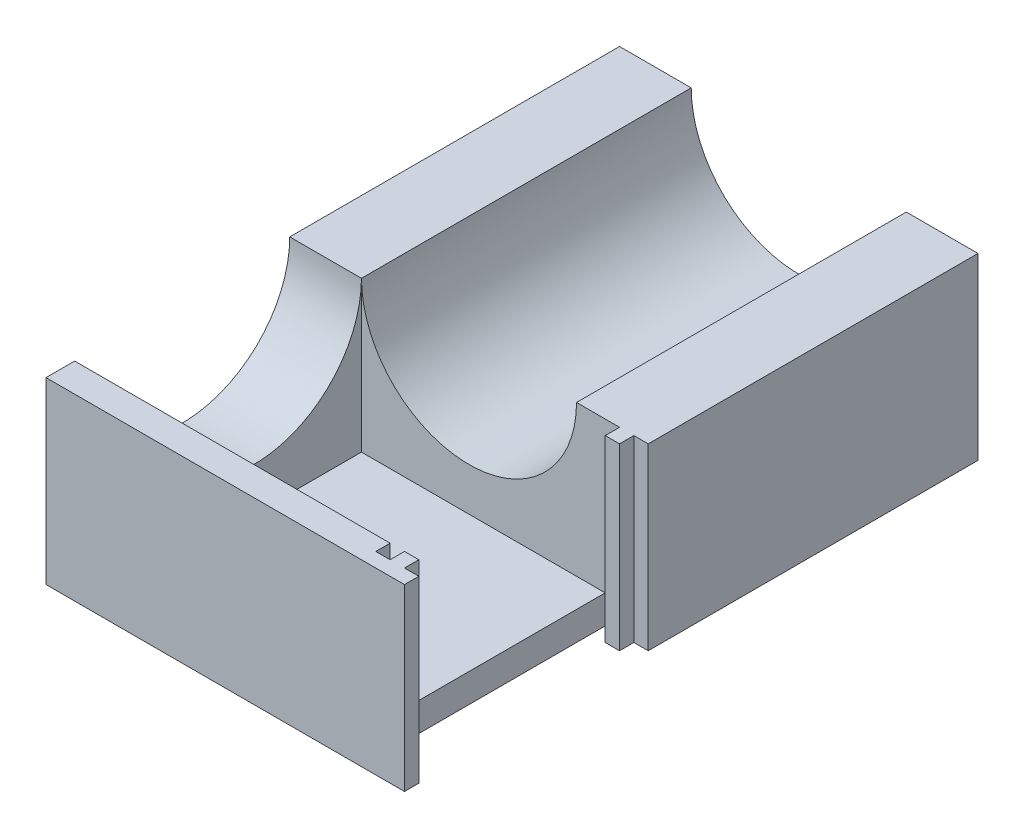
ISO-10303-21;
HEADER;
FILE_DESCRIPTION(('STEP AP214'),'2;1');
FILE_NAME('part.step','',(''),(''),'','','');
FILE_SCHEMA(('AUTOMOTIVE_DESIGN { 1 0 10303 214 1 1 1 1 }'));
ENDSEC;
DATA;
#1=APPLICATION_CONTEXT('core data for automotive mechanical design processes');
#2=APPLICATION_PROTOCOL_DEFINITION('international standard','automotive_design',2000,#1);
#3=PRODUCT_CONTEXT('',#1,'mechanical');
#4=PRODUCT('Part','Part','',(#3));
#5=PRODUCT_RELATED_PRODUCT_CATEGORY('part','',(#4));
#6=PRODUCT_DEFINITION_FORMATION('','',#4);
#7=PRODUCT_DEFINITION_CONTEXT('part definition',#1,'design');
#8=PRODUCT_DEFINITION('design','',#6,#7);
#9=PRODUCT_DEFINITION_SHAPE('','',#8);
#10=(LENGTH_UNIT() NAMED_UNIT(*) SI_UNIT(.MILLI.,.METRE.));
#11=(NAMED_UNIT(*) PLANE_ANGLE_UNIT() SI_UNIT($,.RADIAN.));
#12=(NAMED_UNIT(*) SI_UNIT($,.STERADIAN.) SOLID_ANGLE_UNIT());
#13=UNCERTAINTY_MEASURE_WITH_UNIT(LENGTH_MEASURE(1.E-05),#10,'distance_accuracy_value','');
#14=(GEOMETRIC_REPRESENTATION_CONTEXT(3) GLOBAL_UNCERTAINTY_ASSIGNED_CONTEXT((#13)) GLOBAL_UNIT_ASSIGNED_CONTEXT((#10,
#11,#12)) REPRESENTATION_CONTEXT('',''));
#15=CARTESIAN_POINT('',(0.,0.,0.));
#16=DIRECTION('',(0.,0.,1.));
#17=DIRECTION('',(1.,0.,0.));
#18=AXIS2_PLACEMENT_3D('',#15,#16,#17);
#19=CARTESIAN_POINT('',(0.,0.,0.));
#20=DIRECTION('',(0.,1.,0.));
#21=DIRECTION('',(0.,0.,1.));
#22=AXIS2_PLACEMENT_3D('',#19,#20,#21);
#23=PLANE('',#22);
#24=DIRECTION('',(-1.,0.,0.));
#25=VECTOR('',#24,1.);
#26=CARTESIAN_POINT('',(0.,0.,0.));
#27=LINE('',#26,#25);
#28=CARTESIAN_POINT('',(12.5,0.,0.));
#29=VERTEX_POINT('',#28);
#30=CARTESIAN_POINT('',(7.5,0.,0.));
#31=VERTEX_POINT('',#30);
#32=EDGE_CURVE('E328',#29,#31,#27,.T.);
#33=ORIENTED_EDGE('',*,*,#32,.T.);
#34=DIRECTION('',(0.,0.,-1.));
#35=VECTOR('',#34,1.);
#36=CARTESIAN_POINT('',(7.5,0.,59.2132034355964));
#37=LINE('',#36,#35);
#38=CARTESIAN_POINT('',(7.5,0.,23.));
#39=VERTEX_POINT('',#38);
#40=EDGE_CURVE('E219',#31,#39,#37,.F.);
#41=ORIENTED_EDGE('',*,*,#40,.T.);
#42=DIRECTION('',(1.,0.,0.));
#43=VECTOR('',#42,1.);
#44=CARTESIAN_POINT('',(0.,0.,23.));
#45=LINE('',#44,#43);
#46=CARTESIAN_POINT('',(10.5,0.,23.));
#47=VERTEX_POINT('',#46);
#48=EDGE_CURVE('E206',#39,#47,#45,.T.);
#49=ORIENTED_EDGE('',*,*,#48,.T.);
#50=DIRECTION('',(0.,0.,1.));
#51=VECTOR('',#50,1.);
#52=CARTESIAN_POINT('',(10.5,0.,24.));
#53=LINE('',#52,#51);
#54=CARTESIAN_POINT('',(10.5,0.,24.));
#55=VERTEX_POINT('',#54);
#56=EDGE_CURVE('E349',#47,#55,#53,.T.);
#57=ORIENTED_EDGE('',*,*,#56,.T.);
#58=DIRECTION('',(1.,0.,0.));
#59=VECTOR('',#58,1.);
#60=CARTESIAN_POINT('',(11.5,0.,24.));
#61=LINE('',#60,#59);
#62=CARTESIAN_POINT('',(11.5,0.,24.));
#63=VERTEX_POINT('',#62);
#64=EDGE_CURVE('E352',#55,#63,#61,.T.);
#65=ORIENTED_EDGE('',*,*,#64,.T.);
#66=DIRECTION('',(0.,0.,-1.));
#67=VECTOR('',#66,1.);
#68=CARTESIAN_POINT('',(11.5,0.,23.));
#69=LINE('',#68,#67);
#70=CARTESIAN_POINT('',(11.5,0.,23.));
#71=VERTEX_POINT('',#70);
#72=EDGE_CURVE('E229',#63,#71,#69,.T.);
#73=ORIENTED_EDGE('',*,*,#72,.T.);
#74=DIRECTION('',(1.,0.,0.));
#75=VECTOR('',#74,1.);
#76=CARTESIAN_POINT('',(12.5,0.,23.));
#77=LINE('',#76,#75);
#78=CARTESIAN_POINT('',(12.5,0.,23.));
#79=VERTEX_POINT('',#78);
#80=EDGE_CURVE('E226',#71,#79,#77,.T.);
#81=ORIENTED_EDGE('',*,*,#80,.T.);
#82=DIRECTION('',(0.,0.,-1.));
#83=VECTOR('',#82,1.);
#84=CARTESIAN_POINT('',(12.5,0.,40.));
#85=LINE('',#84,#83);
#86=EDGE_CURVE('E220',#79,#29,#85,.T.);
#87=ORIENTED_EDGE('',*,*,#86,.T.);
#88=EDGE_LOOP('',(#33,#41,#49,#57,#65,#73,#81,#87));
#89=FACE_BOUND('',#88,.T.);
#90=ADVANCED_FACE('F34',(#89),#23,.T.);
#91=DIRECTION('',(0.,0.,-1.));
#92=VECTOR('',#91,1.);
#93=CARTESIAN_POINT('',(-7.5,0.,59.2132034355964));
#94=LINE('',#93,#92);
#95=CARTESIAN_POINT('',(-7.5,0.,23.));
#96=VERTEX_POINT('',#95);
#97=CARTESIAN_POINT('',(-7.5,0.,0.));
#98=VERTEX_POINT('',#97);
#99=EDGE_CURVE('E214',#96,#98,#94,.T.);
#100=ORIENTED_EDGE('',*,*,#99,.T.);
#101=CARTESIAN_POINT('',(-12.5,0.,0.));
#102=VERTEX_POINT('',#101);
#103=EDGE_CURVE('E329',#98,#102,#27,.T.);
#104=ORIENTED_EDGE('',*,*,#103,.T.);
#105=DIRECTION('',(0.,0.,1.));
#106=VECTOR('',#105,1.);
#107=CARTESIAN_POINT('',(-12.5,0.,40.));
#108=LINE('',#107,#106);
#109=CARTESIAN_POINT('',(-12.5,0.,23.));
#110=VERTEX_POINT('',#109);
#111=EDGE_CURVE('E225',#102,#110,#108,.T.);
#112=ORIENTED_EDGE('',*,*,#111,.T.);
#113=DIRECTION('',(-1.,0.,0.));
#114=VECTOR('',#113,1.);
#115=CARTESIAN_POINT('',(12.501,0.,23.));
#116=LINE('',#115,#114);
#117=EDGE_CURVE('E198',#110,#96,#116,.F.);
#118=ORIENTED_EDGE('',*,*,#117,.T.);
#119=EDGE_LOOP('',(#100,#104,#112,#118));
#120=FACE_BOUND('',#119,.T.);
#121=ADVANCED_FACE('F223',(#120),#23,.T.);
#122=DIRECTION('',(0.,0.,-1.));
#123=VECTOR('',#122,1.);
#124=CARTESIAN_POINT('',(12.5,0.,40.));
#125=LINE('',#124,#123);
#126=CARTESIAN_POINT('',(12.5,0.,40.));
#127=VERTEX_POINT('',#126);
#128=CARTESIAN_POINT('',(12.5,0.,39.));
#129=VERTEX_POINT('',#128);
#130=EDGE_CURVE('E318',#127,#129,#125,.T.);
#131=ORIENTED_EDGE('',*,*,#130,.T.);
#132=DIRECTION('',(-1.,0.,0.));
#133=VECTOR('',#132,1.);
#134=CARTESIAN_POINT('',(12.5,0.,39.));
#135=LINE('',#134,#133);
#136=CARTESIAN_POINT('',(11.5,0.,39.));
#137=VERTEX_POINT('',#136);
#138=EDGE_CURVE('E334',#129,#137,#135,.T.);
#139=ORIENTED_EDGE('',*,*,#138,.T.);
#140=DIRECTION('',(0.,0.,-1.));
#141=VECTOR('',#140,1.);
#142=CARTESIAN_POINT('',(11.5,0.,39.));
#143=LINE('',#142,#141);
#144=CARTESIAN_POINT('',(11.5,0.,38.));
#145=VERTEX_POINT('',#144);
#146=EDGE_CURVE('E337',#137,#145,#143,.T.);
#147=ORIENTED_EDGE('',*,*,#146,.T.);
#148=DIRECTION('',(-1.,0.,0.));
#149=VECTOR('',#148,1.);
#150=CARTESIAN_POINT('',(11.5,0.,38.));
#151=LINE('',#150,#149);
#152=CARTESIAN_POINT('',(10.5,0.,38.));
#153=VERTEX_POINT('',#152);
#154=EDGE_CURVE('E340',#145,#153,#151,.T.);
#155=ORIENTED_EDGE('',*,*,#154,.T.);
#156=DIRECTION('',(0.,0.,1.));
#157=VECTOR('',#156,1.);
#158=CARTESIAN_POINT('',(10.5,0.,38.));
#159=LINE('',#158,#157);
#160=CARTESIAN_POINT('',(10.5,0.,39.));
#161=VERTEX_POINT('',#160);
#162=EDGE_CURVE('E343',#153,#161,#159,.T.);
#163=ORIENTED_EDGE('',*,*,#162,.T.);
#164=DIRECTION('',(-1.,0.,0.));
#165=VECTOR('',#164,1.);
#166=CARTESIAN_POINT('',(10.5,0.,39.));
#167=LINE('',#166,#165);
#168=CARTESIAN_POINT('',(9.50000000000001,0.,39.));
#169=VERTEX_POINT('',#168);
#170=EDGE_CURVE('E346',#161,#169,#167,.T.);
#171=ORIENTED_EDGE('',*,*,#170,.T.);
#172=DIRECTION('',(0.,0.,-1.));
#173=VECTOR('',#172,1.);
#174=CARTESIAN_POINT('',(9.5,0.,23.));
#175=LINE('',#174,#173);
#176=CARTESIAN_POINT('',(9.5,0.,38.));
#177=VERTEX_POINT('',#176);
#178=EDGE_CURVE('E331',#169,#177,#175,.T.);
#179=ORIENTED_EDGE('',*,*,#178,.T.);
#180=DIRECTION('',(1.,0.,0.));
#181=VECTOR('',#180,1.);
#182=CARTESIAN_POINT('',(0.,0.,38.));
#183=LINE('',#182,#181);
#184=CARTESIAN_POINT('',(-7.5,0.,38.));
#185=VERTEX_POINT('',#184);
#186=EDGE_CURVE('E315',#185,#177,#183,.T.);
#187=ORIENTED_EDGE('',*,*,#186,.F.);
#188=DIRECTION('',(-1.,0.,0.));
#189=VECTOR('',#188,1.);
#190=CARTESIAN_POINT('',(12.501,0.,38.));
#191=LINE('',#190,#189);
#192=CARTESIAN_POINT('',(-12.5,0.,38.));
#193=VERTEX_POINT('',#192);
#194=EDGE_CURVE('E200',#185,#193,#191,.T.);
#195=ORIENTED_EDGE('',*,*,#194,.T.);
#196=CARTESIAN_POINT('',(-12.5,0.,40.));
#197=VERTEX_POINT('',#196);
#198=EDGE_CURVE('E325',#193,#197,#108,.T.);
#199=ORIENTED_EDGE('',*,*,#198,.T.);
#200=DIRECTION('',(-1.,0.,0.));
#201=VECTOR('',#200,1.);
#202=CARTESIAN_POINT('',(0.,0.,40.));
#203=LINE('',#202,#201);
#204=EDGE_CURVE('E312',#127,#197,#203,.T.);
#205=ORIENTED_EDGE('',*,*,#204,.F.);
#206=EDGE_LOOP('',(#131,#139,#147,#155,#163,#171,#179,#187,#195,#199,#205));
#207=FACE_BOUND('',#206,.T.);
#208=ADVANCED_FACE('F405',(#207),#23,.T.);
#209=CARTESIAN_POINT('',(12.5,12.5,40.));
#210=DIRECTION('',(-1.,0.,0.));
#211=DIRECTION('',(0.,-1.,0.));
#212=AXIS2_PLACEMENT_3D('',#209,#210,#211);
#213=PLANE('',#212);
#214=ORIENTED_EDGE('',*,*,#130,.F.);
#215=DIRECTION('',(0.,1.,0.));
#216=VECTOR('',#215,1.);
#217=CARTESIAN_POINT('',(12.5,12.5,40.));
#218=LINE('',#217,#216);
#219=CARTESIAN_POINT('',(12.5,-12.5,40.));
#220=VERTEX_POINT('',#219);
#221=EDGE_CURVE('E236',#220,#127,#218,.T.);
#222=ORIENTED_EDGE('',*,*,#221,.F.);
#223=DIRECTION('',(0.,0.,-1.));
#224=VECTOR('',#223,1.);
#225=CARTESIAN_POINT('',(12.5,-12.5,40.));
#226=LINE('',#225,#224);
#227=CARTESIAN_POINT('',(12.5,-12.5,39.));
#228=VERTEX_POINT('',#227);
#229=EDGE_CURVE('E367',#220,#228,#226,.T.);
#230=ORIENTED_EDGE('',*,*,#229,.T.);
#231=DIRECTION('',(0.,1.,0.));
#232=VECTOR('',#231,1.);
#233=CARTESIAN_POINT('',(12.5,-12.5,39.));
#234=LINE('',#233,#232);
#235=EDGE_CURVE('E250',#228,#129,#234,.T.);
#236=ORIENTED_EDGE('',*,*,#235,.T.);
#237=EDGE_LOOP('',(#214,#222,#230,#236));
#238=FACE_BOUND('',#237,.T.);
#239=ADVANCED_FACE('F403',(#238),#213,.F.);
#240=CARTESIAN_POINT('',(0.,0.,23.));
#241=DIRECTION('',(0.,0.,-1.));
#242=DIRECTION('',(-1.,0.,0.));
#243=AXIS2_PLACEMENT_3D('',#240,#241,#242);
#244=PLANE('',#243);
#245=ORIENTED_EDGE('',*,*,#48,.F.);
#246=CARTESIAN_POINT('',(0.,0.,23.));
#247=DIRECTION('',(0.,0.,-1.));
#248=DIRECTION('',(-1.,0.,0.));
#249=AXIS2_PLACEMENT_3D('',#246,#247,#248);
#250=CIRCLE('',#249,7.5);
#251=EDGE_CURVE('E202',#39,#96,#250,.T.);
#252=ORIENTED_EDGE('',*,*,#251,.T.);
#253=DIRECTION('',(0.,-1.,0.));
#254=VECTOR('',#253,1.);
#255=CARTESIAN_POINT('',(-7.5,10.5,23.));
#256=LINE('',#255,#254);
#257=CARTESIAN_POINT('',(-7.5,-10.5,23.));
#258=VERTEX_POINT('',#257);
#259=EDGE_CURVE('E180',#96,#258,#256,.T.);
#260=ORIENTED_EDGE('',*,*,#259,.T.);
#261=DIRECTION('',(1.,0.,0.));
#262=VECTOR('',#261,1.);
#263=CARTESIAN_POINT('',(-7.5,-10.5,23.));
#264=LINE('',#263,#262);
#265=CARTESIAN_POINT('',(9.50000000000001,-10.5,23.));
#266=VERTEX_POINT('',#265);
#267=EDGE_CURVE('E191',#258,#266,#264,.T.);
#268=ORIENTED_EDGE('',*,*,#267,.T.);
#269=DIRECTION('',(0.,1.,0.));
#270=VECTOR('',#269,1.);
#271=CARTESIAN_POINT('',(9.5,-12.5,23.));
#272=LINE('',#271,#270);
#273=CARTESIAN_POINT('',(9.5,-12.5,23.));
#274=VERTEX_POINT('',#273);
#275=EDGE_CURVE('E262',#274,#266,#272,.T.);
#276=ORIENTED_EDGE('',*,*,#275,.F.);
#277=DIRECTION('',(-1.,0.,0.));
#278=VECTOR('',#277,1.);
#279=CARTESIAN_POINT('',(10.5,-12.5,23.));
#280=LINE('',#279,#278);
#281=CARTESIAN_POINT('',(10.5,-12.5,23.));
#282=VERTEX_POINT('',#281);
#283=EDGE_CURVE('E299',#282,#274,#280,.T.);
#284=ORIENTED_EDGE('',*,*,#283,.F.);
#285=DIRECTION('',(0.,1.,0.));
#286=VECTOR('',#285,1.);
#287=CARTESIAN_POINT('',(10.5,-12.5,23.));
#288=LINE('',#287,#286);
#289=EDGE_CURVE('E264',#282,#47,#288,.T.);
#290=ORIENTED_EDGE('',*,*,#289,.T.);
#291=EDGE_LOOP('',(#245,#252,#260,#268,#276,#284,#290));
#292=FACE_BOUND('',#291,.T.);
#293=ADVANCED_FACE('F204',(#292),#244,.F.);
#294=CARTESIAN_POINT('',(0.,0.,38.));
#295=DIRECTION('',(0.,0.,-1.));
#296=DIRECTION('',(-1.,0.,0.));
#297=AXIS2_PLACEMENT_3D('',#294,#295,#296);
#298=PLANE('',#297);
#299=DIRECTION('',(0.,-1.,0.));
#300=VECTOR('',#299,1.);
#301=CARTESIAN_POINT('',(-7.5,10.5,38.));
#302=LINE('',#301,#300);
#303=CARTESIAN_POINT('',(-7.5,-10.5,38.));
#304=VERTEX_POINT('',#303);
#305=EDGE_CURVE('E211',#185,#304,#302,.T.);
#306=ORIENTED_EDGE('',*,*,#305,.F.);
#307=ORIENTED_EDGE('',*,*,#186,.T.);
#308=DIRECTION('',(0.,1.,0.));
#309=VECTOR('',#308,1.);
#310=CARTESIAN_POINT('',(9.5,10.5,38.));
#311=LINE('',#310,#309);
#312=CARTESIAN_POINT('',(9.50000000000001,-10.5,38.));
#313=VERTEX_POINT('',#312);
#314=EDGE_CURVE('E190',#313,#177,#311,.T.);
#315=ORIENTED_EDGE('',*,*,#314,.F.);
#316=DIRECTION('',(1.,0.,0.));
#317=VECTOR('',#316,1.);
#318=CARTESIAN_POINT('',(9.50000000000001,-10.5,38.));
#319=LINE('',#318,#317);
#320=EDGE_CURVE('E247',#304,#313,#319,.T.);
#321=ORIENTED_EDGE('',*,*,#320,.F.);
#322=EDGE_LOOP('',(#306,#307,#315,#321));
#323=FACE_BOUND('',#322,.T.);
#324=ADVANCED_FACE('F381',(#323),#298,.T.);
#325=CARTESIAN_POINT('',(0.,0.,59.2132034355964));
#326=DIRECTION('',(0.,0.,-1.));
#327=DIRECTION('',(-1.,0.,0.));
#328=AXIS2_PLACEMENT_3D('',#325,#326,#327);
#329=CYLINDRICAL_SURFACE('',#328,7.5);
#330=ORIENTED_EDGE('',*,*,#40,.F.);
#331=CARTESIAN_POINT('',(0.,0.,0.));
#332=DIRECTION('',(0.,0.,-1.));
#333=DIRECTION('',(-1.,0.,0.));
#334=AXIS2_PLACEMENT_3D('',#331,#332,#333);
#335=CIRCLE('',#334,7.5);
#336=EDGE_CURVE('E210',#31,#98,#335,.T.);
#337=ORIENTED_EDGE('',*,*,#336,.T.);
#338=ORIENTED_EDGE('',*,*,#99,.F.);
#339=ORIENTED_EDGE('',*,*,#251,.F.);
#340=EDGE_LOOP('',(#330,#337,#338,#339));
#341=FACE_BOUND('',#340,.T.);
#342=ADVANCED_FACE('F215',(#341),#329,.F.);
#343=ORIENTED_EDGE('',*,*,#86,.F.);
#344=DIRECTION('',(0.,1.,0.));
#345=VECTOR('',#344,1.);
#346=CARTESIAN_POINT('',(12.5,-12.5,23.));
#347=LINE('',#346,#345);
#348=CARTESIAN_POINT('',(12.5,-12.5,23.));
#349=VERTEX_POINT('',#348);
#350=EDGE_CURVE('E271',#349,#79,#347,.T.);
#351=ORIENTED_EDGE('',*,*,#350,.F.);
#352=CARTESIAN_POINT('',(12.5,-12.5,0.));
#353=VERTEX_POINT('',#352);
#354=EDGE_CURVE('E362',#349,#353,#226,.T.);
#355=ORIENTED_EDGE('',*,*,#354,.T.);
#356=DIRECTION('',(0.,1.,0.));
#357=VECTOR('',#356,1.);
#358=CARTESIAN_POINT('',(12.5,12.5,0.));
#359=LINE('',#358,#357);
#360=EDGE_CURVE('E243',#353,#29,#359,.T.);
#361=ORIENTED_EDGE('',*,*,#360,.T.);
#362=EDGE_LOOP('',(#343,#351,#355,#361));
#363=FACE_BOUND('',#362,.T.);
#364=ADVANCED_FACE('F408',(#363),#213,.F.);
#365=CARTESIAN_POINT('',(-12.5,12.5,40.));
#366=DIRECTION('',(1.,0.,0.));
#367=DIRECTION('',(0.,1.,0.));
#368=AXIS2_PLACEMENT_3D('',#365,#366,#367);
#369=PLANE('',#368);
#370=ORIENTED_EDGE('',*,*,#111,.F.);
#371=DIRECTION('',(0.,-1.,0.));
#372=VECTOR('',#371,1.);
#373=CARTESIAN_POINT('',(-12.5,12.5,0.));
#374=LINE('',#373,#372);
#375=CARTESIAN_POINT('',(-12.5,-12.5,0.));
#376=VERTEX_POINT('',#375);
#377=EDGE_CURVE('E241',#102,#376,#374,.T.);
#378=ORIENTED_EDGE('',*,*,#377,.T.);
#379=DIRECTION('',(0.,0.,-1.));
#380=VECTOR('',#379,1.);
#381=CARTESIAN_POINT('',(-12.5,-12.5,40.));
#382=LINE('',#381,#380);
#383=CARTESIAN_POINT('',(-12.5,-12.5,40.));
#384=VERTEX_POINT('',#383);
#385=EDGE_CURVE('E314',#384,#376,#382,.T.);
#386=ORIENTED_EDGE('',*,*,#385,.F.);
#387=DIRECTION('',(0.,-1.,0.));
#388=VECTOR('',#387,1.);
#389=CARTESIAN_POINT('',(-12.5,12.5,40.));
#390=LINE('',#389,#388);
#391=EDGE_CURVE('E234',#197,#384,#390,.T.);
#392=ORIENTED_EDGE('',*,*,#391,.F.);
#393=ORIENTED_EDGE('',*,*,#198,.F.);
#394=CARTESIAN_POINT('',(-12.5,0.,30.5));
#395=DIRECTION('',(-1.,0.,0.));
#396=DIRECTION('',(0.,-1.,0.));
#397=AXIS2_PLACEMENT_3D('',#394,#395,#396);
#398=CIRCLE('',#397,7.5);
#399=EDGE_CURVE('E11',#110,#193,#398,.T.);
#400=ORIENTED_EDGE('',*,*,#399,.F.);
#401=EDGE_LOOP('',(#370,#378,#386,#392,#393,#400));
#402=FACE_BOUND('',#401,.T.);
#403=ADVANCED_FACE('F420',(#402),#369,.F.);
#404=CARTESIAN_POINT('',(0.,0.,40.));
#405=DIRECTION('',(0.,0.,1.));
#406=DIRECTION('',(1.,0.,0.));
#407=AXIS2_PLACEMENT_3D('',#404,#405,#406);
#408=PLANE('',#407);
#409=ORIENTED_EDGE('',*,*,#221,.T.);
#410=ORIENTED_EDGE('',*,*,#204,.T.);
#411=ORIENTED_EDGE('',*,*,#391,.T.);
#412=DIRECTION('',(1.,0.,0.));
#413=VECTOR('',#412,1.);
#414=CARTESIAN_POINT('',(-12.5,-12.5,40.));
#415=LINE('',#414,#413);
#416=EDGE_CURVE('E237',#384,#220,#415,.T.);
#417=ORIENTED_EDGE('',*,*,#416,.T.);
#418=EDGE_LOOP('',(#409,#410,#411,#417));
#419=FACE_BOUND('',#418,.T.);
#420=ADVANCED_FACE('F36',(#419),#408,.T.);
#421=CARTESIAN_POINT('',(0.,0.,0.));
#422=DIRECTION('',(0.,0.,1.));
#423=DIRECTION('',(1.,0.,0.));
#424=AXIS2_PLACEMENT_3D('',#421,#422,#423);
#425=PLANE('',#424);
#426=ORIENTED_EDGE('',*,*,#32,.F.);
#427=ORIENTED_EDGE('',*,*,#360,.F.);
#428=DIRECTION('',(1.,0.,0.));
#429=VECTOR('',#428,1.);
#430=CARTESIAN_POINT('',(-12.5,-12.5,0.));
#431=LINE('',#430,#429);
#432=EDGE_CURVE('E240',#376,#353,#431,.T.);
#433=ORIENTED_EDGE('',*,*,#432,.F.);
#434=ORIENTED_EDGE('',*,*,#377,.F.);
#435=ORIENTED_EDGE('',*,*,#103,.F.);
#436=ORIENTED_EDGE('',*,*,#336,.F.);
#437=EDGE_LOOP('',(#426,#427,#433,#434,#435,#436));
#438=FACE_BOUND('',#437,.T.);
#439=ADVANCED_FACE('F430',(#438),#425,.F.);
#440=CARTESIAN_POINT('',(9.5,-12.5,23.));
#441=DIRECTION('',(-1.,0.,0.));
#442=DIRECTION('',(0.,0.,1.));
#443=AXIS2_PLACEMENT_3D('',#440,#441,#442);
#444=PLANE('',#443);
#445=ORIENTED_EDGE('',*,*,#178,.F.);
#446=DIRECTION('',(0.,1.,0.));
#447=VECTOR('',#446,1.);
#448=CARTESIAN_POINT('',(9.50000000000001,-12.5,39.));
#449=LINE('',#448,#447);
#450=CARTESIAN_POINT('',(9.50000000000001,-12.5,39.));
#451=VERTEX_POINT('',#450);
#452=EDGE_CURVE('E260',#451,#169,#449,.T.);
#453=ORIENTED_EDGE('',*,*,#452,.F.);
#454=DIRECTION('',(0.,0.,1.));
#455=VECTOR('',#454,1.);
#456=CARTESIAN_POINT('',(9.5,-12.5,23.));
#457=LINE('',#456,#455);
#458=EDGE_CURVE('E296',#274,#451,#457,.T.);
#459=ORIENTED_EDGE('',*,*,#458,.F.);
#460=ORIENTED_EDGE('',*,*,#275,.T.);
#461=DIRECTION('',(0.,0.,1.));
#462=VECTOR('',#461,1.);
#463=CARTESIAN_POINT('',(9.50000000000001,-10.5,23.));
#464=LINE('',#463,#462);
#465=EDGE_CURVE('E244',#266,#313,#464,.T.);
#466=ORIENTED_EDGE('',*,*,#465,.T.);
#467=ORIENTED_EDGE('',*,*,#314,.T.);
#468=EDGE_LOOP('',(#445,#453,#459,#460,#466,#467));
#469=FACE_BOUND('',#468,.T.);
#470=ADVANCED_FACE('F384',(#469),#444,.F.);
#471=CARTESIAN_POINT('',(12.5,-12.5,39.));
#472=DIRECTION('',(0.,0.,1.));
#473=DIRECTION('',(1.,0.,0.));
#474=AXIS2_PLACEMENT_3D('',#471,#472,#473);
#475=PLANE('',#474);
#476=ORIENTED_EDGE('',*,*,#138,.F.);
#477=ORIENTED_EDGE('',*,*,#235,.F.);
#478=DIRECTION('',(1.,0.,0.));
#479=VECTOR('',#478,1.);
#480=CARTESIAN_POINT('',(12.5,-12.5,39.));
#481=LINE('',#480,#479);
#482=CARTESIAN_POINT('',(11.5,-12.5,39.));
#483=VERTEX_POINT('',#482);
#484=EDGE_CURVE('E272',#483,#228,#481,.T.);
#485=ORIENTED_EDGE('',*,*,#484,.F.);
#486=DIRECTION('',(0.,1.,0.));
#487=VECTOR('',#486,1.);
#488=CARTESIAN_POINT('',(11.5,-12.5,39.));
#489=LINE('',#488,#487);
#490=EDGE_CURVE('E252',#483,#137,#489,.T.);
#491=ORIENTED_EDGE('',*,*,#490,.T.);
#492=EDGE_LOOP('',(#476,#477,#485,#491));
#493=FACE_BOUND('',#492,.T.);
#494=ADVANCED_FACE('F451',(#493),#475,.F.);
#495=CARTESIAN_POINT('',(11.5,-12.5,39.));
#496=DIRECTION('',(-1.,0.,0.));
#497=DIRECTION('',(0.,0.,1.));
#498=AXIS2_PLACEMENT_3D('',#495,#496,#497);
#499=PLANE('',#498);
#500=ORIENTED_EDGE('',*,*,#146,.F.);
#501=ORIENTED_EDGE('',*,*,#490,.F.);
#502=DIRECTION('',(0.,0.,1.));
#503=VECTOR('',#502,1.);
#504=CARTESIAN_POINT('',(11.5,-12.5,39.));
#505=LINE('',#504,#503);
#506=CARTESIAN_POINT('',(11.5,-12.5,38.));
#507=VERTEX_POINT('',#506);
#508=EDGE_CURVE('E276',#507,#483,#505,.T.);
#509=ORIENTED_EDGE('',*,*,#508,.F.);
#510=DIRECTION('',(0.,1.,0.));
#511=VECTOR('',#510,1.);
#512=CARTESIAN_POINT('',(11.5,-12.5,38.));
#513=LINE('',#512,#511);
#514=EDGE_CURVE('E254',#507,#145,#513,.T.);
#515=ORIENTED_EDGE('',*,*,#514,.T.);
#516=EDGE_LOOP('',(#500,#501,#509,#515));
#517=FACE_BOUND('',#516,.T.);
#518=ADVANCED_FACE('F448',(#517),#499,.F.);
#519=CARTESIAN_POINT('',(11.5,-12.5,38.));
#520=DIRECTION('',(0.,0.,1.));
#521=DIRECTION('',(1.,0.,0.));
#522=AXIS2_PLACEMENT_3D('',#519,#520,#521);
#523=PLANE('',#522);
#524=ORIENTED_EDGE('',*,*,#154,.F.);
#525=ORIENTED_EDGE('',*,*,#514,.F.);
#526=DIRECTION('',(1.,0.,0.));
#527=VECTOR('',#526,1.);
#528=CARTESIAN_POINT('',(11.5,-12.5,38.));
#529=LINE('',#528,#527);
#530=CARTESIAN_POINT('',(10.5,-12.5,38.));
#531=VERTEX_POINT('',#530);
#532=EDGE_CURVE('E283',#531,#507,#529,.T.);
#533=ORIENTED_EDGE('',*,*,#532,.F.);
#534=DIRECTION('',(0.,1.,0.));
#535=VECTOR('',#534,1.);
#536=CARTESIAN_POINT('',(10.5,-12.5,38.));
#537=LINE('',#536,#535);
#538=EDGE_CURVE('E256',#531,#153,#537,.T.);
#539=ORIENTED_EDGE('',*,*,#538,.T.);
#540=EDGE_LOOP('',(#524,#525,#533,#539));
#541=FACE_BOUND('',#540,.T.);
#542=ADVANCED_FACE('F444',(#541),#523,.F.);
#543=CARTESIAN_POINT('',(10.5,-12.5,38.));
#544=DIRECTION('',(1.,0.,0.));
#545=DIRECTION('',(0.,0.,-1.));
#546=AXIS2_PLACEMENT_3D('',#543,#544,#545);
#547=PLANE('',#546);
#548=ORIENTED_EDGE('',*,*,#162,.F.);
#549=ORIENTED_EDGE('',*,*,#538,.F.);
#550=DIRECTION('',(0.,0.,-1.));
#551=VECTOR('',#550,1.);
#552=CARTESIAN_POINT('',(10.5,-12.5,38.));
#553=LINE('',#552,#551);
#554=CARTESIAN_POINT('',(10.5,-12.5,39.));
#555=VERTEX_POINT('',#554);
#556=EDGE_CURVE('E290',#555,#531,#553,.T.);
#557=ORIENTED_EDGE('',*,*,#556,.F.);
#558=DIRECTION('',(0.,1.,0.));
#559=VECTOR('',#558,1.);
#560=CARTESIAN_POINT('',(10.5,-12.5,39.));
#561=LINE('',#560,#559);
#562=EDGE_CURVE('E258',#555,#161,#561,.T.);
#563=ORIENTED_EDGE('',*,*,#562,.T.);
#564=EDGE_LOOP('',(#548,#549,#557,#563));
#565=FACE_BOUND('',#564,.T.);
#566=ADVANCED_FACE('F441',(#565),#547,.F.);
#567=CARTESIAN_POINT('',(10.5,-12.5,39.));
#568=DIRECTION('',(0.,0.,1.));
#569=DIRECTION('',(1.,0.,0.));
#570=AXIS2_PLACEMENT_3D('',#567,#568,#569);
#571=PLANE('',#570);
#572=ORIENTED_EDGE('',*,*,#170,.F.);
#573=ORIENTED_EDGE('',*,*,#562,.F.);
#574=DIRECTION('',(1.,0.,0.));
#575=VECTOR('',#574,1.);
#576=CARTESIAN_POINT('',(10.5,-12.5,39.));
#577=LINE('',#576,#575);
#578=EDGE_CURVE('E293',#451,#555,#577,.T.);
#579=ORIENTED_EDGE('',*,*,#578,.F.);
#580=ORIENTED_EDGE('',*,*,#452,.T.);
#581=EDGE_LOOP('',(#572,#573,#579,#580));
#582=FACE_BOUND('',#581,.T.);
#583=ADVANCED_FACE('F401',(#582),#571,.F.);
#584=CARTESIAN_POINT('',(10.5,-12.5,24.));
#585=DIRECTION('',(1.,0.,0.));
#586=DIRECTION('',(0.,0.,-1.));
#587=AXIS2_PLACEMENT_3D('',#584,#585,#586);
#588=PLANE('',#587);
#589=ORIENTED_EDGE('',*,*,#56,.F.);
#590=ORIENTED_EDGE('',*,*,#289,.F.);
#591=DIRECTION('',(0.,0.,-1.));
#592=VECTOR('',#591,1.);
#593=CARTESIAN_POINT('',(10.5,-12.5,24.));
#594=LINE('',#593,#592);
#595=CARTESIAN_POINT('',(10.5,-12.5,24.));
#596=VERTEX_POINT('',#595);
#597=EDGE_CURVE('E302',#596,#282,#594,.T.);
#598=ORIENTED_EDGE('',*,*,#597,.F.);
#599=DIRECTION('',(0.,1.,0.));
#600=VECTOR('',#599,1.);
#601=CARTESIAN_POINT('',(10.5,-12.5,24.));
#602=LINE('',#601,#600);
#603=EDGE_CURVE('E266',#596,#55,#602,.T.);
#604=ORIENTED_EDGE('',*,*,#603,.T.);
#605=EDGE_LOOP('',(#589,#590,#598,#604));
#606=FACE_BOUND('',#605,.T.);
#607=ADVANCED_FACE('F390',(#606),#588,.F.);
#608=CARTESIAN_POINT('',(11.5,-12.5,24.));
#609=DIRECTION('',(0.,0.,-1.));
#610=DIRECTION('',(-1.,0.,0.));
#611=AXIS2_PLACEMENT_3D('',#608,#609,#610);
#612=PLANE('',#611);
#613=ORIENTED_EDGE('',*,*,#64,.F.);
#614=ORIENTED_EDGE('',*,*,#603,.F.);
#615=DIRECTION('',(-1.,0.,0.));
#616=VECTOR('',#615,1.);
#617=CARTESIAN_POINT('',(11.5,-12.5,24.));
#618=LINE('',#617,#616);
#619=CARTESIAN_POINT('',(11.5,-12.5,24.));
#620=VERTEX_POINT('',#619);
#621=EDGE_CURVE('E305',#620,#596,#618,.T.);
#622=ORIENTED_EDGE('',*,*,#621,.F.);
#623=DIRECTION('',(0.,1.,0.));
#624=VECTOR('',#623,1.);
#625=CARTESIAN_POINT('',(11.5,-12.5,24.));
#626=LINE('',#625,#624);
#627=EDGE_CURVE('E57',#620,#63,#626,.T.);
#628=ORIENTED_EDGE('',*,*,#627,.T.);
#629=EDGE_LOOP('',(#613,#614,#622,#628));
#630=FACE_BOUND('',#629,.T.);
#631=ADVANCED_FACE('F392',(#630),#612,.F.);
#632=CARTESIAN_POINT('',(11.5,-12.5,23.));
#633=DIRECTION('',(-1.,0.,0.));
#634=DIRECTION('',(0.,0.,1.));
#635=AXIS2_PLACEMENT_3D('',#632,#633,#634);
#636=PLANE('',#635);
#637=ORIENTED_EDGE('',*,*,#72,.F.);
#638=ORIENTED_EDGE('',*,*,#627,.F.);
#639=DIRECTION('',(0.,0.,1.));
#640=VECTOR('',#639,1.);
#641=CARTESIAN_POINT('',(11.5,-12.5,23.));
#642=LINE('',#641,#640);
#643=CARTESIAN_POINT('',(11.5,-12.5,23.));
#644=VERTEX_POINT('',#643);
#645=EDGE_CURVE('E308',#644,#620,#642,.T.);
#646=ORIENTED_EDGE('',*,*,#645,.F.);
#647=DIRECTION('',(0.,1.,0.));
#648=VECTOR('',#647,1.);
#649=CARTESIAN_POINT('',(11.5,-12.5,23.));
#650=LINE('',#649,#648);
#651=EDGE_CURVE('E269',#644,#71,#650,.T.);
#652=ORIENTED_EDGE('',*,*,#651,.T.);
#653=EDGE_LOOP('',(#637,#638,#646,#652));
#654=FACE_BOUND('',#653,.T.);
#655=ADVANCED_FACE('F394',(#654),#636,.F.);
#656=CARTESIAN_POINT('',(12.5,-12.5,23.));
#657=DIRECTION('',(0.,0.,-1.));
#658=DIRECTION('',(-1.,0.,0.));
#659=AXIS2_PLACEMENT_3D('',#656,#657,#658);
#660=PLANE('',#659);
#661=ORIENTED_EDGE('',*,*,#80,.F.);
#662=ORIENTED_EDGE('',*,*,#651,.F.);
#663=DIRECTION('',(-1.,0.,0.));
#664=VECTOR('',#663,1.);
#665=CARTESIAN_POINT('',(12.5,-12.5,23.));
#666=LINE('',#665,#664);
#667=EDGE_CURVE('E49',#349,#644,#666,.T.);
#668=ORIENTED_EDGE('',*,*,#667,.F.);
#669=ORIENTED_EDGE('',*,*,#350,.T.);
#670=EDGE_LOOP('',(#661,#662,#668,#669));
#671=FACE_BOUND('',#670,.T.);
#672=ADVANCED_FACE('F358',(#671),#660,.F.);
#673=CARTESIAN_POINT('',(12.501,0.,30.5));
#674=DIRECTION('',(-1.,0.,0.));
#675=DIRECTION('',(0.,-1.,0.));
#676=AXIS2_PLACEMENT_3D('',#673,#674,#675);
#677=CYLINDRICAL_SURFACE('',#676,7.5);
#678=ORIENTED_EDGE('',*,*,#117,.F.);
#679=ORIENTED_EDGE('',*,*,#399,.T.);
#680=ORIENTED_EDGE('',*,*,#194,.F.);
#681=CARTESIAN_POINT('',(-7.5,0.,30.5));
#682=DIRECTION('',(-1.,0.,0.));
#683=DIRECTION('',(0.,-1.,0.));
#684=AXIS2_PLACEMENT_3D('',#681,#682,#683);
#685=CIRCLE('',#684,7.5);
#686=EDGE_CURVE('E42',#185,#96,#685,.F.);
#687=ORIENTED_EDGE('',*,*,#686,.T.);
#688=EDGE_LOOP('',(#678,#679,#680,#687));
#689=FACE_BOUND('',#688,.T.);
#690=ADVANCED_FACE('F196',(#689),#677,.F.);
#691=CARTESIAN_POINT('',(9.50000000000001,-10.5,23.));
#692=DIRECTION('',(0.,-1.,0.));
#693=DIRECTION('',(0.,0.,-1.));
#694=AXIS2_PLACEMENT_3D('',#691,#692,#693);
#695=PLANE('',#694);
#696=ORIENTED_EDGE('',*,*,#320,.T.);
#697=ORIENTED_EDGE('',*,*,#465,.F.);
#698=ORIENTED_EDGE('',*,*,#267,.F.);
#699=DIRECTION('',(0.,0.,1.));
#700=VECTOR('',#699,1.);
#701=CARTESIAN_POINT('',(-7.5,-10.5,23.));
#702=LINE('',#701,#700);
#703=EDGE_CURVE('E185',#258,#304,#702,.T.);
#704=ORIENTED_EDGE('',*,*,#703,.T.);
#705=EDGE_LOOP('',(#696,#697,#698,#704));
#706=FACE_BOUND('',#705,.T.);
#707=ADVANCED_FACE('F379',(#706),#695,.F.);
#708=CARTESIAN_POINT('',(-7.5,10.5,23.));
#709=DIRECTION('',(-1.,0.,0.));
#710=DIRECTION('',(0.,-1.,0.));
#711=AXIS2_PLACEMENT_3D('',#708,#709,#710);
#712=PLANE('',#711);
#713=ORIENTED_EDGE('',*,*,#259,.F.);
#714=ORIENTED_EDGE('',*,*,#686,.F.);
#715=ORIENTED_EDGE('',*,*,#305,.T.);
#716=ORIENTED_EDGE('',*,*,#703,.F.);
#717=EDGE_LOOP('',(#713,#714,#715,#716));
#718=FACE_BOUND('',#717,.T.);
#719=ADVANCED_FACE('F182',(#718),#712,.F.);
#720=CARTESIAN_POINT('',(-12.5,-12.5,40.));
#721=DIRECTION('',(0.,1.,0.));
#722=DIRECTION('',(0.,0.,1.));
#723=AXIS2_PLACEMENT_3D('',#720,#721,#722);
#724=PLANE('',#723);
#725=ORIENTED_EDGE('',*,*,#508,.T.);
#726=ORIENTED_EDGE('',*,*,#484,.T.);
#727=ORIENTED_EDGE('',*,*,#229,.F.);
#728=ORIENTED_EDGE('',*,*,#416,.F.);
#729=ORIENTED_EDGE('',*,*,#385,.T.);
#730=ORIENTED_EDGE('',*,*,#432,.T.);
#731=ORIENTED_EDGE('',*,*,#354,.F.);
#732=ORIENTED_EDGE('',*,*,#667,.T.);
#733=ORIENTED_EDGE('',*,*,#645,.T.);
#734=ORIENTED_EDGE('',*,*,#621,.T.);
#735=ORIENTED_EDGE('',*,*,#597,.T.);
#736=ORIENTED_EDGE('',*,*,#283,.T.);
#737=ORIENTED_EDGE('',*,*,#458,.T.);
#738=ORIENTED_EDGE('',*,*,#578,.T.);
#739=ORIENTED_EDGE('',*,*,#556,.T.);
#740=ORIENTED_EDGE('',*,*,#532,.T.);
#741=EDGE_LOOP('',(#725,#726,#727,#728,#729,#730,#731,#732,#733,#734,#735,#736,#737,#738,#739,#740));
#742=FACE_BOUND('',#741,.T.);
#743=ADVANCED_FACE('F360',(#742),#724,.F.);
#744=CLOSED_SHELL('',(#90,#121,#208,#239,#293,#324,#342,#364,#403,#420,#439,#470,#494,#518,#542,
#566,#583,#607,#631,#655,#672,#690,#707,#719,#743));
#745=MANIFOLD_SOLID_BREP('B2',#744);
#746=ADVANCED_BREP_SHAPE_REPRESENTATION('',(#18,#745),#14);
#747=SHAPE_DEFINITION_REPRESENTATION(#9,#746);
ENDSEC;
END-ISO-10303-21;
